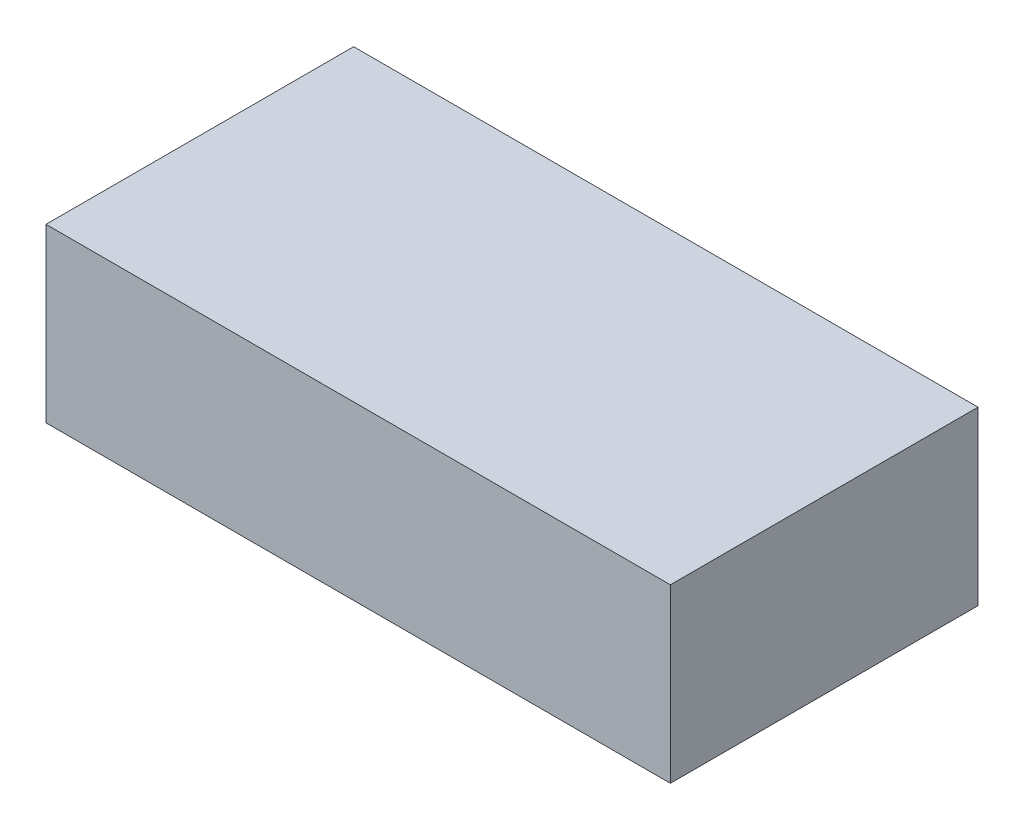
ISO-10303-21;
HEADER;
FILE_DESCRIPTION(('STEP AP214'),'2;1');
FILE_NAME('part.step','',(''),(''),'','','');
FILE_SCHEMA(('AUTOMOTIVE_DESIGN { 1 0 10303 214 1 1 1 1 }'));
ENDSEC;
DATA;
#1=APPLICATION_CONTEXT('core data for automotive mechanical design processes');
#2=APPLICATION_PROTOCOL_DEFINITION('international standard','automotive_design',2000,#1);
#3=PRODUCT_CONTEXT('',#1,'mechanical');
#4=PRODUCT('Part','Part','',(#3));
#5=PRODUCT_RELATED_PRODUCT_CATEGORY('part','',(#4));
#6=PRODUCT_DEFINITION_FORMATION('','',#4);
#7=PRODUCT_DEFINITION_CONTEXT('part definition',#1,'design');
#8=PRODUCT_DEFINITION('design','',#6,#7);
#9=PRODUCT_DEFINITION_SHAPE('','',#8);
#10=(LENGTH_UNIT() NAMED_UNIT(*) SI_UNIT(.MILLI.,.METRE.));
#11=(NAMED_UNIT(*) PLANE_ANGLE_UNIT() SI_UNIT($,.RADIAN.));
#12=(NAMED_UNIT(*) SI_UNIT($,.STERADIAN.) SOLID_ANGLE_UNIT());
#13=UNCERTAINTY_MEASURE_WITH_UNIT(LENGTH_MEASURE(1.E-05),#10,'distance_accuracy_value','');
#14=(GEOMETRIC_REPRESENTATION_CONTEXT(3) GLOBAL_UNCERTAINTY_ASSIGNED_CONTEXT((#13)) GLOBAL_UNIT_ASSIGNED_CONTEXT((#10,
#11,#12)) REPRESENTATION_CONTEXT('',''));
#15=CARTESIAN_POINT('',(0.,0.,0.));
#16=DIRECTION('',(0.,0.,1.));
#17=DIRECTION('',(1.,0.,0.));
#18=AXIS2_PLACEMENT_3D('',#15,#16,#17);
#19=CARTESIAN_POINT('',(34.5,19.,-17.));
#20=DIRECTION('',(-1.,0.,0.));
#21=DIRECTION('',(0.,0.,1.));
#22=AXIS2_PLACEMENT_3D('',#19,#20,#21);
#23=PLANE('',#22);
#24=DIRECTION('',(0.,0.,-1.));
#25=VECTOR('',#24,1.);
#26=CARTESIAN_POINT('',(34.5,0.,-17.));
#27=LINE('',#26,#25);
#28=CARTESIAN_POINT('',(34.5,0.,17.));
#29=VERTEX_POINT('',#28);
#30=CARTESIAN_POINT('',(34.5,0.,-17.));
#31=VERTEX_POINT('',#30);
#32=EDGE_CURVE('E98',#29,#31,#27,.T.);
#33=ORIENTED_EDGE('',*,*,#32,.T.);
#34=DIRECTION('',(0.,-1.,0.));
#35=VECTOR('',#34,1.);
#36=CARTESIAN_POINT('',(34.5,19.,-17.));
#37=LINE('',#36,#35);
#38=CARTESIAN_POINT('',(34.5,19.,-17.));
#39=VERTEX_POINT('',#38);
#40=EDGE_CURVE('E11',#39,#31,#37,.T.);
#41=ORIENTED_EDGE('',*,*,#40,.F.);
#42=DIRECTION('',(0.,0.,-1.));
#43=VECTOR('',#42,1.);
#44=CARTESIAN_POINT('',(34.5,19.,-17.));
#45=LINE('',#44,#43);
#46=CARTESIAN_POINT('',(34.5,19.,17.));
#47=VERTEX_POINT('',#46);
#48=EDGE_CURVE('E86',#47,#39,#45,.T.);
#49=ORIENTED_EDGE('',*,*,#48,.F.);
#50=DIRECTION('',(0.,-1.,0.));
#51=VECTOR('',#50,1.);
#52=CARTESIAN_POINT('',(34.5,19.,17.));
#53=LINE('',#52,#51);
#54=EDGE_CURVE('E94',#47,#29,#53,.T.);
#55=ORIENTED_EDGE('',*,*,#54,.T.);
#56=EDGE_LOOP('',(#33,#41,#49,#55));
#57=FACE_BOUND('',#56,.T.);
#58=ADVANCED_FACE('F35',(#57),#23,.F.);
#59=CARTESIAN_POINT('',(-34.5,19.,-17.));
#60=DIRECTION('',(0.,0.,1.));
#61=DIRECTION('',(1.,0.,0.));
#62=AXIS2_PLACEMENT_3D('',#59,#60,#61);
#63=PLANE('',#62);
#64=DIRECTION('',(-1.,0.,0.));
#65=VECTOR('',#64,1.);
#66=CARTESIAN_POINT('',(-34.5,0.,-17.));
#67=LINE('',#66,#65);
#68=CARTESIAN_POINT('',(-34.5,0.,-17.));
#69=VERTEX_POINT('',#68);
#70=EDGE_CURVE('E90',#31,#69,#67,.T.);
#71=ORIENTED_EDGE('',*,*,#70,.T.);
#72=DIRECTION('',(0.,-1.,0.));
#73=VECTOR('',#72,1.);
#74=CARTESIAN_POINT('',(-34.5,19.,-17.));
#75=LINE('',#74,#73);
#76=CARTESIAN_POINT('',(-34.5,19.,-17.));
#77=VERTEX_POINT('',#76);
#78=EDGE_CURVE('E43',#77,#69,#75,.T.);
#79=ORIENTED_EDGE('',*,*,#78,.F.);
#80=DIRECTION('',(-1.,0.,0.));
#81=VECTOR('',#80,1.);
#82=CARTESIAN_POINT('',(-34.5,19.,-17.));
#83=LINE('',#82,#81);
#84=EDGE_CURVE('E81',#39,#77,#83,.T.);
#85=ORIENTED_EDGE('',*,*,#84,.F.);
#86=ORIENTED_EDGE('',*,*,#40,.T.);
#87=EDGE_LOOP('',(#71,#79,#85,#86));
#88=FACE_BOUND('',#87,.T.);
#89=ADVANCED_FACE('F89',(#88),#63,.F.);
#90=CARTESIAN_POINT('',(-34.5,19.,-17.));
#91=DIRECTION('',(1.,0.,0.));
#92=DIRECTION('',(0.,0.,-1.));
#93=AXIS2_PLACEMENT_3D('',#90,#91,#92);
#94=PLANE('',#93);
#95=DIRECTION('',(0.,0.,1.));
#96=VECTOR('',#95,1.);
#97=CARTESIAN_POINT('',(-34.5,0.,-17.));
#98=LINE('',#97,#96);
#99=CARTESIAN_POINT('',(-34.5,0.,17.));
#100=VERTEX_POINT('',#99);
#101=EDGE_CURVE('E68',#69,#100,#98,.T.);
#102=ORIENTED_EDGE('',*,*,#101,.T.);
#103=DIRECTION('',(0.,-1.,0.));
#104=VECTOR('',#103,1.);
#105=CARTESIAN_POINT('',(-34.5,19.,17.));
#106=LINE('',#105,#104);
#107=CARTESIAN_POINT('',(-34.5,19.,17.));
#108=VERTEX_POINT('',#107);
#109=EDGE_CURVE('E91',#108,#100,#106,.T.);
#110=ORIENTED_EDGE('',*,*,#109,.F.);
#111=DIRECTION('',(0.,0.,1.));
#112=VECTOR('',#111,1.);
#113=CARTESIAN_POINT('',(-34.5,19.,-17.));
#114=LINE('',#113,#112);
#115=EDGE_CURVE('E84',#77,#108,#114,.T.);
#116=ORIENTED_EDGE('',*,*,#115,.F.);
#117=ORIENTED_EDGE('',*,*,#78,.T.);
#118=EDGE_LOOP('',(#102,#110,#116,#117));
#119=FACE_BOUND('',#118,.T.);
#120=ADVANCED_FACE('F92',(#119),#94,.F.);
#121=CARTESIAN_POINT('',(-34.5,19.,17.));
#122=DIRECTION('',(0.,0.,-1.));
#123=DIRECTION('',(-1.,0.,0.));
#124=AXIS2_PLACEMENT_3D('',#121,#122,#123);
#125=PLANE('',#124);
#126=DIRECTION('',(1.,0.,0.));
#127=VECTOR('',#126,1.);
#128=CARTESIAN_POINT('',(-34.5,0.,17.));
#129=LINE('',#128,#127);
#130=EDGE_CURVE('E74',#100,#29,#129,.T.);
#131=ORIENTED_EDGE('',*,*,#130,.T.);
#132=ORIENTED_EDGE('',*,*,#54,.F.);
#133=DIRECTION('',(1.,0.,0.));
#134=VECTOR('',#133,1.);
#135=CARTESIAN_POINT('',(-34.5,19.,17.));
#136=LINE('',#135,#134);
#137=EDGE_CURVE('E51',#108,#47,#136,.T.);
#138=ORIENTED_EDGE('',*,*,#137,.F.);
#139=ORIENTED_EDGE('',*,*,#109,.T.);
#140=EDGE_LOOP('',(#131,#132,#138,#139));
#141=FACE_BOUND('',#140,.T.);
#142=ADVANCED_FACE('F105',(#141),#125,.F.);
#143=CARTESIAN_POINT('',(0.,19.,0.));
#144=DIRECTION('',(0.,1.,0.));
#145=DIRECTION('',(0.,0.,1.));
#146=AXIS2_PLACEMENT_3D('',#143,#144,#145);
#147=PLANE('',#146);
#148=ORIENTED_EDGE('',*,*,#48,.T.);
#149=ORIENTED_EDGE('',*,*,#84,.T.);
#150=ORIENTED_EDGE('',*,*,#115,.T.);
#151=ORIENTED_EDGE('',*,*,#137,.T.);
#152=EDGE_LOOP('',(#148,#149,#150,#151));
#153=FACE_BOUND('',#152,.T.);
#154=ADVANCED_FACE('F82',(#153),#147,.T.);
#155=CARTESIAN_POINT('',(0.,0.,0.));
#156=DIRECTION('',(0.,1.,0.));
#157=DIRECTION('',(0.,0.,1.));
#158=AXIS2_PLACEMENT_3D('',#155,#156,#157);
#159=PLANE('',#158);
#160=ORIENTED_EDGE('',*,*,#32,.F.);
#161=ORIENTED_EDGE('',*,*,#130,.F.);
#162=ORIENTED_EDGE('',*,*,#101,.F.);
#163=ORIENTED_EDGE('',*,*,#70,.F.);
#164=EDGE_LOOP('',(#160,#161,#162,#163));
#165=FACE_BOUND('',#164,.T.);
#166=ADVANCED_FACE('F108',(#165),#159,.F.);
#167=CLOSED_SHELL('',(#58,#89,#120,#142,#154,#166));
#168=MANIFOLD_SOLID_BREP('B2',#167);
#169=ADVANCED_BREP_SHAPE_REPRESENTATION('',(#18,#168),#14);
#170=SHAPE_DEFINITION_REPRESENTATION(#9,#169);
ENDSEC;
END-ISO-10303-21;
